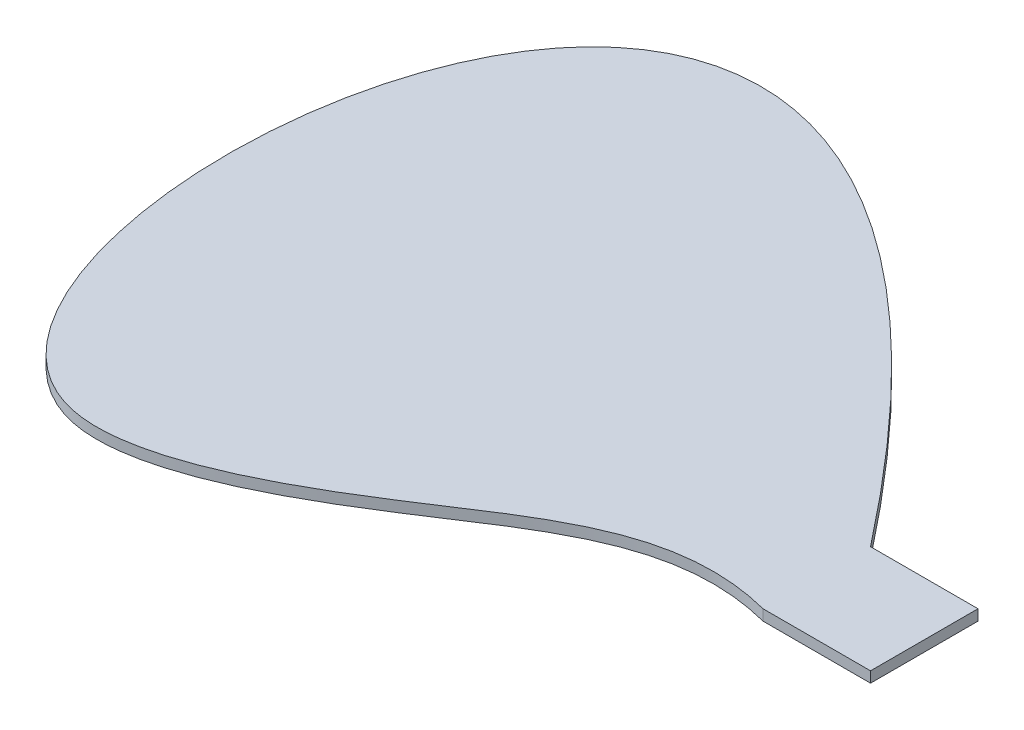
ISO-10303-21;
HEADER;
FILE_DESCRIPTION(('STEP AP214'),'2;1');
FILE_NAME('part.step','',(''),(''),'','','');
FILE_SCHEMA(('AUTOMOTIVE_DESIGN { 1 0 10303 214 1 1 1 1 }'));
ENDSEC;
DATA;
#1=APPLICATION_CONTEXT('core data for automotive mechanical design processes');
#2=APPLICATION_PROTOCOL_DEFINITION('international standard','automotive_design',2000,#1);
#3=PRODUCT_CONTEXT('',#1,'mechanical');
#4=PRODUCT('Part','Part','',(#3));
#5=PRODUCT_RELATED_PRODUCT_CATEGORY('part','',(#4));
#6=PRODUCT_DEFINITION_FORMATION('','',#4);
#7=PRODUCT_DEFINITION_CONTEXT('part definition',#1,'design');
#8=PRODUCT_DEFINITION('design','',#6,#7);
#9=PRODUCT_DEFINITION_SHAPE('','',#8);
#10=(LENGTH_UNIT() NAMED_UNIT(*) SI_UNIT(.MILLI.,.METRE.));
#11=(NAMED_UNIT(*) PLANE_ANGLE_UNIT() SI_UNIT($,.RADIAN.));
#12=(NAMED_UNIT(*) SI_UNIT($,.STERADIAN.) SOLID_ANGLE_UNIT());
#13=UNCERTAINTY_MEASURE_WITH_UNIT(LENGTH_MEASURE(1.E-05),#10,'distance_accuracy_value','');
#14=(GEOMETRIC_REPRESENTATION_CONTEXT(3) GLOBAL_UNCERTAINTY_ASSIGNED_CONTEXT((#13)) GLOBAL_UNIT_ASSIGNED_CONTEXT((#10,
#11,#12)) REPRESENTATION_CONTEXT('',''));
#15=CARTESIAN_POINT('',(0.,0.,0.));
#16=DIRECTION('',(0.,0.,1.));
#17=DIRECTION('',(1.,0.,0.));
#18=AXIS2_PLACEMENT_3D('',#15,#16,#17);
#19=CARTESIAN_POINT('',(2.5,0.25,-2.5));
#20=DIRECTION('',(-1.,0.,0.));
#21=DIRECTION('',(0.,0.,1.));
#22=AXIS2_PLACEMENT_3D('',#19,#20,#21);
#23=PLANE('',#22);
#24=DIRECTION('',(0.,0.,-1.));
#25=VECTOR('',#24,1.);
#26=CARTESIAN_POINT('',(2.5,-0.25,-2.5));
#27=LINE('',#26,#25);
#28=CARTESIAN_POINT('',(2.5,-0.25,2.5));
#29=VERTEX_POINT('',#28);
#30=CARTESIAN_POINT('',(2.5,-0.25,-2.5));
#31=VERTEX_POINT('',#30);
#32=EDGE_CURVE('E118',#29,#31,#27,.T.);
#33=ORIENTED_EDGE('',*,*,#32,.T.);
#34=DIRECTION('',(0.,-1.,0.));
#35=VECTOR('',#34,1.);
#36=CARTESIAN_POINT('',(2.5,0.25,-2.5));
#37=LINE('',#36,#35);
#38=CARTESIAN_POINT('',(2.5,0.25,-2.5));
#39=VERTEX_POINT('',#38);
#40=EDGE_CURVE('E11',#39,#31,#37,.T.);
#41=ORIENTED_EDGE('',*,*,#40,.F.);
#42=DIRECTION('',(0.,0.,-1.));
#43=VECTOR('',#42,1.);
#44=CARTESIAN_POINT('',(2.5,0.25,-2.5));
#45=LINE('',#44,#43);
#46=CARTESIAN_POINT('',(2.5,0.25,2.5));
#47=VERTEX_POINT('',#46);
#48=EDGE_CURVE('E86',#47,#39,#45,.T.);
#49=ORIENTED_EDGE('',*,*,#48,.F.);
#50=DIRECTION('',(0.,-1.,0.));
#51=VECTOR('',#50,1.);
#52=CARTESIAN_POINT('',(2.5,0.25,2.5));
#53=LINE('',#52,#51);
#54=EDGE_CURVE('E94',#47,#29,#53,.T.);
#55=ORIENTED_EDGE('',*,*,#54,.T.);
#56=EDGE_LOOP('',(#33,#41,#49,#55));
#57=FACE_BOUND('',#56,.T.);
#58=ADVANCED_FACE('F35',(#57),#23,.F.);
#59=CARTESIAN_POINT('',(-2.5,0.25,-2.5));
#60=DIRECTION('',(0.,0.,1.));
#61=DIRECTION('',(1.,0.,0.));
#62=AXIS2_PLACEMENT_3D('',#59,#60,#61);
#63=PLANE('',#62);
#64=DIRECTION('',(-1.,0.,0.));
#65=VECTOR('',#64,1.);
#66=CARTESIAN_POINT('',(-2.5,-0.25,-2.5));
#67=LINE('',#66,#65);
#68=CARTESIAN_POINT('',(-2.5,-0.25,-2.49999999999998));
#69=VERTEX_POINT('',#68);
#70=EDGE_CURVE('E90',#31,#69,#67,.T.);
#71=ORIENTED_EDGE('',*,*,#70,.T.);
#72=DIRECTION('',(0.,-1.,0.));
#73=VECTOR('',#72,1.);
#74=CARTESIAN_POINT('',(-2.5,0.25,-2.49999999999998));
#75=LINE('',#74,#73);
#76=CARTESIAN_POINT('',(-2.5,0.25,-2.49999999999998));
#77=VERTEX_POINT('',#76);
#78=EDGE_CURVE('E43',#77,#69,#75,.T.);
#79=ORIENTED_EDGE('',*,*,#78,.F.);
#80=DIRECTION('',(-1.,0.,0.));
#81=VECTOR('',#80,1.);
#82=CARTESIAN_POINT('',(-2.5,0.25,-2.5));
#83=LINE('',#82,#81);
#84=EDGE_CURVE('E81',#39,#77,#83,.T.);
#85=ORIENTED_EDGE('',*,*,#84,.F.);
#86=ORIENTED_EDGE('',*,*,#40,.T.);
#87=EDGE_LOOP('',(#71,#79,#85,#86));
#88=FACE_BOUND('',#87,.T.);
#89=ADVANCED_FACE('F89',(#88),#63,.F.);
#90=CARTESIAN_POINT('',(-2.5,0.25,-2.49999999999998));
#91=CARTESIAN_POINT('',(-34.6800036856421,0.25,-43.65787791039));
#92=CARTESIAN_POINT('',(-40.6312865524388,0.25,19.8708162944212));
#93=CARTESIAN_POINT('',(-14.088083086118,0.25,6.50174089851708));
#94=CARTESIAN_POINT('',(-7.95451782807732,0.25,1.1042150922862));
#95=CARTESIAN_POINT('',(-2.5,0.25,2.5));
#96=B_SPLINE_CURVE_WITH_KNOTS('',3,(#90,#91,#92,#93,#94,#95),.UNSPECIFIED.,.F.,.F.,(4,1,1,4),
(0.,0.640052887255207,0.799117782460946,1.),.UNSPECIFIED.);
#97=DIRECTION('',(0.,-1.,0.));
#98=VECTOR('',#97,1.);
#99=SURFACE_OF_LINEAR_EXTRUSION('',#96,#98);
#100=CARTESIAN_POINT('',(-2.5,-0.25,-2.49999999999998));
#101=CARTESIAN_POINT('',(-34.6800036856421,-0.25,-43.65787791039));
#102=CARTESIAN_POINT('',(-40.6312865524388,-0.25,19.8708162944212));
#103=CARTESIAN_POINT('',(-14.088083086118,-0.25,6.50174089851708));
#104=CARTESIAN_POINT('',(-7.95451782807732,-0.25,1.1042150922862));
#105=CARTESIAN_POINT('',(-2.5,-0.25,2.5));
#106=B_SPLINE_CURVE_WITH_KNOTS('',3,(#100,#101,#102,#103,#104,#105),.UNSPECIFIED.,.F.,.F.,(4,1,
1,4),(0.,0.640052887255207,0.799117782460946,1.),.UNSPECIFIED.);
#107=CARTESIAN_POINT('',(-2.5,-0.25,2.5));
#108=VERTEX_POINT('',#107);
#109=EDGE_CURVE('E68',#69,#108,#106,.T.);
#110=ORIENTED_EDGE('',*,*,#109,.T.);
#111=DIRECTION('',(0.,-1.,0.));
#112=VECTOR('',#111,1.);
#113=CARTESIAN_POINT('',(-2.5,0.25,2.5));
#114=LINE('',#113,#112);
#115=CARTESIAN_POINT('',(-2.5,0.25,2.5));
#116=VERTEX_POINT('',#115);
#117=EDGE_CURVE('E91',#116,#108,#114,.T.);
#118=ORIENTED_EDGE('',*,*,#117,.F.);
#119=EDGE_CURVE('E84',#77,#116,#96,.T.);
#120=ORIENTED_EDGE('',*,*,#119,.F.);
#121=ORIENTED_EDGE('',*,*,#78,.T.);
#122=EDGE_LOOP('',(#110,#118,#120,#121));
#123=FACE_BOUND('',#122,.T.);
#124=ADVANCED_FACE('F92',(#123),#99,.F.);
#125=CARTESIAN_POINT('',(-2.5,0.25,2.5));
#126=DIRECTION('',(0.,0.,-1.));
#127=DIRECTION('',(-1.,0.,0.));
#128=AXIS2_PLACEMENT_3D('',#125,#126,#127);
#129=PLANE('',#128);
#130=DIRECTION('',(1.,0.,0.));
#131=VECTOR('',#130,1.);
#132=CARTESIAN_POINT('',(-2.5,-0.25,2.5));
#133=LINE('',#132,#131);
#134=EDGE_CURVE('E74',#108,#29,#133,.T.);
#135=ORIENTED_EDGE('',*,*,#134,.T.);
#136=ORIENTED_EDGE('',*,*,#54,.F.);
#137=DIRECTION('',(1.,0.,0.));
#138=VECTOR('',#137,1.);
#139=CARTESIAN_POINT('',(-2.5,0.25,2.5));
#140=LINE('',#139,#138);
#141=EDGE_CURVE('E51',#116,#47,#140,.T.);
#142=ORIENTED_EDGE('',*,*,#141,.F.);
#143=ORIENTED_EDGE('',*,*,#117,.T.);
#144=EDGE_LOOP('',(#135,#136,#142,#143));
#145=FACE_BOUND('',#144,.T.);
#146=ADVANCED_FACE('F107',(#145),#129,.F.);
#147=CARTESIAN_POINT('',(-32.4901561923442,0.25,2.97504383357739));
#148=DIRECTION('',(0.,-1.,0.));
#149=DIRECTION('',(0.,0.,-1.));
#150=AXIS2_PLACEMENT_3D('',#147,#148,#149);
#151=PLANE('',#150);
#152=ORIENTED_EDGE('',*,*,#48,.T.);
#153=ORIENTED_EDGE('',*,*,#84,.T.);
#154=ORIENTED_EDGE('',*,*,#119,.T.);
#155=ORIENTED_EDGE('',*,*,#141,.T.);
#156=EDGE_LOOP('',(#152,#153,#154,#155));
#157=FACE_BOUND('',#156,.T.);
#158=ADVANCED_FACE('F82',(#157),#151,.F.);
#159=CARTESIAN_POINT('',(-32.4901561923442,-0.25,2.97504383357739));
#160=DIRECTION('',(0.,-1.,0.));
#161=DIRECTION('',(0.,0.,-1.));
#162=AXIS2_PLACEMENT_3D('',#159,#160,#161);
#163=PLANE('',#162);
#164=ORIENTED_EDGE('',*,*,#32,.F.);
#165=ORIENTED_EDGE('',*,*,#134,.F.);
#166=ORIENTED_EDGE('',*,*,#109,.F.);
#167=ORIENTED_EDGE('',*,*,#70,.F.);
#168=EDGE_LOOP('',(#164,#165,#166,#167));
#169=FACE_BOUND('',#168,.T.);
#170=ADVANCED_FACE('F130',(#169),#163,.T.);
#171=CLOSED_SHELL('',(#58,#89,#124,#146,#158,#170));
#172=MANIFOLD_SOLID_BREP('B2',#171);
#173=ADVANCED_BREP_SHAPE_REPRESENTATION('',(#18,#172),#14);
#174=SHAPE_DEFINITION_REPRESENTATION(#9,#173);
ENDSEC;
END-ISO-10303-21;
